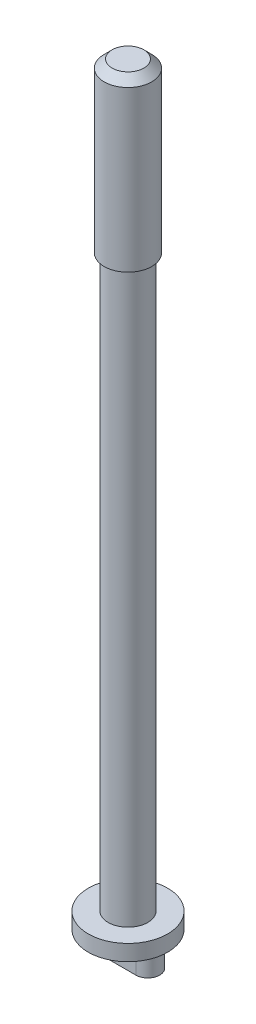
ISO-10303-21;
HEADER;
FILE_DESCRIPTION(('STEP AP214'),'2;1');
FILE_NAME('part.step','',(''),(''),'','','');
FILE_SCHEMA(('AUTOMOTIVE_DESIGN { 1 0 10303 214 1 1 1 1 }'));
ENDSEC;
DATA;
#1=APPLICATION_CONTEXT('core data for automotive mechanical design processes');
#2=APPLICATION_PROTOCOL_DEFINITION('international standard','automotive_design',2000,#1);
#3=PRODUCT_CONTEXT('',#1,'mechanical');
#4=PRODUCT('Part','Part','',(#3));
#5=PRODUCT_RELATED_PRODUCT_CATEGORY('part','',(#4));
#6=PRODUCT_DEFINITION_FORMATION('','',#4);
#7=PRODUCT_DEFINITION_CONTEXT('part definition',#1,'design');
#8=PRODUCT_DEFINITION('design','',#6,#7);
#9=PRODUCT_DEFINITION_SHAPE('','',#8);
#10=(LENGTH_UNIT() NAMED_UNIT(*) SI_UNIT(.MILLI.,.METRE.));
#11=(NAMED_UNIT(*) PLANE_ANGLE_UNIT() SI_UNIT($,.RADIAN.));
#12=(NAMED_UNIT(*) SI_UNIT($,.STERADIAN.) SOLID_ANGLE_UNIT());
#13=UNCERTAINTY_MEASURE_WITH_UNIT(LENGTH_MEASURE(1.E-05),#10,'distance_accuracy_value','');
#14=(GEOMETRIC_REPRESENTATION_CONTEXT(3) GLOBAL_UNCERTAINTY_ASSIGNED_CONTEXT((#13)) GLOBAL_UNIT_ASSIGNED_CONTEXT((#10,
#11,#12)) REPRESENTATION_CONTEXT('',''));
#15=CARTESIAN_POINT('',(0.,0.,0.));
#16=DIRECTION('',(0.,0.,1.));
#17=DIRECTION('',(1.,0.,0.));
#18=AXIS2_PLACEMENT_3D('',#15,#16,#17);
#19=CARTESIAN_POINT('',(-49.9082196139705,-89.7840104629929,0.000144362672608936));
#20=DIRECTION('',(0.,1.,0.));
#21=DIRECTION('',(0.,0.,1.));
#22=AXIS2_PLACEMENT_3D('',#19,#20,#21);
#23=PLANE('',#22);
#24=CARTESIAN_POINT('',(-47.4079596060045,-89.7840104629929,0.));
#25=DIRECTION('',(0.,-1.,0.));
#26=DIRECTION('',(0.,0.,-1.));
#27=AXIS2_PLACEMENT_3D('',#24,#25,#26);
#28=CIRCLE('',#27,1.5);
#29=CARTESIAN_POINT('',(-47.4080080433199,-89.7840104629929,1.49999999921794));
#30=VERTEX_POINT('',#29);
#31=CARTESIAN_POINT('',(-47.4079596060045,-89.7840104629929,-1.5));
#32=VERTEX_POINT('',#31);
#33=EDGE_CURVE('E60',#30,#32,#28,.F.);
#34=ORIENTED_EDGE('',*,*,#33,.F.);
#35=DIRECTION('',(0.999999999478628,0.,3.22915436094326E-05));
#36=VECTOR('',#35,1.);
#37=CARTESIAN_POINT('',(-52.3860001512234,-89.7840104629929,1.49983925216862));
#38=LINE('',#37,#36);
#39=CARTESIAN_POINT('',(-52.4300159249889,-89.7840104629929,1.49983783083134));
#40=VERTEX_POINT('',#39);
#41=EDGE_CURVE('E58',#40,#30,#38,.T.);
#42=ORIENTED_EDGE('',*,*,#41,.F.);
#43=CARTESIAN_POINT('',(-52.4079596060045,-89.7840104629929,0.));
#44=DIRECTION('',(0.,-1.,0.));
#45=DIRECTION('',(0.,0.,-1.));
#46=AXIS2_PLACEMENT_3D('',#43,#44,#45);
#47=CIRCLE('',#46,1.5);
#48=CARTESIAN_POINT('',(-52.4079596060045,-89.7840104629929,-1.5));
#49=VERTEX_POINT('',#48);
#50=EDGE_CURVE('E21',#49,#40,#47,.F.);
#51=ORIENTED_EDGE('',*,*,#50,.F.);
#52=DIRECTION('',(-1.,0.,0.));
#53=VECTOR('',#52,1.);
#54=CARTESIAN_POINT('',(-47.4079596060045,-89.7840104629929,-1.5));
#55=LINE('',#54,#53);
#56=EDGE_CURVE('E69',#32,#49,#55,.T.);
#57=ORIENTED_EDGE('',*,*,#56,.F.);
#58=EDGE_LOOP('',(#34,#42,#51,#57));
#59=FACE_BOUND('',#58,.T.);
#60=ADVANCED_FACE('F17',(#59),#23,.F.);
#61=CARTESIAN_POINT('',(-47.4079596060045,-86.7840104629929,-1.5));
#62=DIRECTION('',(0.,0.,-1.));
#63=DIRECTION('',(-1.,0.,0.));
#64=AXIS2_PLACEMENT_3D('',#61,#62,#63);
#65=PLANE('',#64);
#66=DIRECTION('',(1.,0.,0.));
#67=VECTOR('',#66,1.);
#68=CARTESIAN_POINT('',(-52.4233651177436,-86.7840104629929,-1.5));
#69=LINE('',#68,#67);
#70=CARTESIAN_POINT('',(-47.4079596060045,-86.7840104629929,-1.5));
#71=VERTEX_POINT('',#70);
#72=CARTESIAN_POINT('',(-52.4079596060045,-86.7840104629929,-1.5));
#73=VERTEX_POINT('',#72);
#74=EDGE_CURVE('E100',#71,#73,#69,.F.);
#75=ORIENTED_EDGE('',*,*,#74,.F.);
#76=DIRECTION('',(0.,-1.,0.));
#77=VECTOR('',#76,1.);
#78=CARTESIAN_POINT('',(-47.4079596060045,-86.7840104629929,-1.5));
#79=LINE('',#78,#77);
#80=EDGE_CURVE('E75',#32,#71,#79,.F.);
#81=ORIENTED_EDGE('',*,*,#80,.F.);
#82=ORIENTED_EDGE('',*,*,#56,.T.);
#83=DIRECTION('',(0.,-1.,0.));
#84=VECTOR('',#83,1.);
#85=CARTESIAN_POINT('',(-52.4079596060045,-86.7840104629929,-1.5));
#86=LINE('',#85,#84);
#87=EDGE_CURVE('E63',#73,#49,#86,.T.);
#88=ORIENTED_EDGE('',*,*,#87,.F.);
#89=EDGE_LOOP('',(#75,#81,#82,#88));
#90=FACE_BOUND('',#89,.T.);
#91=ADVANCED_FACE('F207',(#90),#65,.T.);
#92=CARTESIAN_POINT('',(-52.4079596060045,-86.7840104629929,0.));
#93=DIRECTION('',(0.,-1.,0.));
#94=DIRECTION('',(0.,0.,-1.));
#95=AXIS2_PLACEMENT_3D('',#92,#93,#94);
#96=CYLINDRICAL_SURFACE('',#95,1.5);
#97=CARTESIAN_POINT('',(-52.4079596060045,-86.7840104629929,0.));
#98=DIRECTION('',(0.,-1.,0.));
#99=DIRECTION('',(0.,0.,-1.));
#100=AXIS2_PLACEMENT_3D('',#97,#98,#99);
#101=CIRCLE('',#100,1.5);
#102=CARTESIAN_POINT('',(-52.4300159249889,-86.7840104629929,1.49983783083134));
#103=VERTEX_POINT('',#102);
#104=EDGE_CURVE('E99',#73,#103,#101,.F.);
#105=ORIENTED_EDGE('',*,*,#104,.F.);
#106=ORIENTED_EDGE('',*,*,#87,.T.);
#107=ORIENTED_EDGE('',*,*,#50,.T.);
#108=DIRECTION('',(0.,1.,0.));
#109=VECTOR('',#108,1.);
#110=CARTESIAN_POINT('',(-52.4300159249889,-86.7840104629929,1.49983783083134));
#111=LINE('',#110,#109);
#112=EDGE_CURVE('E62',#103,#40,#111,.F.);
#113=ORIENTED_EDGE('',*,*,#112,.F.);
#114=EDGE_LOOP('',(#105,#106,#107,#113));
#115=FACE_BOUND('',#114,.T.);
#116=ADVANCED_FACE('F68',(#115),#96,.T.);
#117=CARTESIAN_POINT('',(-52.3860001512234,-86.7840104629929,1.49983925216862));
#118=DIRECTION('',(-3.22915436094326E-05,0.,0.999999999478628));
#119=DIRECTION('',(0.999999999478628,0.,3.22915436094326E-05));
#120=AXIS2_PLACEMENT_3D('',#117,#118,#119);
#121=PLANE('',#120);
#122=DIRECTION('',(0.999999999478628,0.,3.22915436094275E-05));
#123=VECTOR('',#122,1.);
#124=CARTESIAN_POINT('',(-52.4300159249889,-86.7840104629929,1.49983783083134));
#125=LINE('',#124,#123);
#126=CARTESIAN_POINT('',(-47.4080080433199,-86.7840104629929,1.49999999921794));
#127=VERTEX_POINT('',#126);
#128=EDGE_CURVE('E72',#103,#127,#125,.T.);
#129=ORIENTED_EDGE('',*,*,#128,.F.);
#130=ORIENTED_EDGE('',*,*,#112,.T.);
#131=ORIENTED_EDGE('',*,*,#41,.T.);
#132=DIRECTION('',(0.,-1.,0.));
#133=VECTOR('',#132,1.);
#134=CARTESIAN_POINT('',(-47.4080080433199,-86.7840104629929,1.49999999921794));
#135=LINE('',#134,#133);
#136=EDGE_CURVE('E36',#127,#30,#135,.T.);
#137=ORIENTED_EDGE('',*,*,#136,.F.);
#138=EDGE_LOOP('',(#129,#130,#131,#137));
#139=FACE_BOUND('',#138,.T.);
#140=ADVANCED_FACE('F70',(#139),#121,.T.);
#141=CARTESIAN_POINT('',(-47.4079596060045,-86.7840104629929,0.));
#142=DIRECTION('',(0.,-1.,0.));
#143=DIRECTION('',(0.,0.,-1.));
#144=AXIS2_PLACEMENT_3D('',#141,#142,#143);
#145=CYLINDRICAL_SURFACE('',#144,1.5);
#146=CARTESIAN_POINT('',(-47.4079596060045,-86.7840104629929,0.));
#147=DIRECTION('',(0.,-1.,0.));
#148=DIRECTION('',(0.,0.,-1.));
#149=AXIS2_PLACEMENT_3D('',#146,#147,#148);
#150=CIRCLE('',#149,1.5);
#151=EDGE_CURVE('E96',#127,#71,#150,.F.);
#152=ORIENTED_EDGE('',*,*,#151,.F.);
#153=ORIENTED_EDGE('',*,*,#136,.T.);
#154=ORIENTED_EDGE('',*,*,#33,.T.);
#155=ORIENTED_EDGE('',*,*,#80,.T.);
#156=EDGE_LOOP('',(#152,#153,#154,#155));
#157=FACE_BOUND('',#156,.T.);
#158=ADVANCED_FACE('F110',(#157),#145,.T.);
#159=CARTESIAN_POINT('',(-50.3401825869688,8.21598953700711,0.));
#160=DIRECTION('',(0.,1.,0.));
#161=DIRECTION('',(0.,0.,1.));
#162=AXIS2_PLACEMENT_3D('',#159,#160,#161);
#163=PLANE('',#162);
#164=CARTESIAN_POINT('',(-49.9079596060045,8.21598953706078,0.));
#165=DIRECTION('',(0.,-1.,0.));
#166=DIRECTION('',(0.,0.,-1.));
#167=AXIS2_PLACEMENT_3D('',#164,#165,#166);
#168=CIRCLE('',#167,1.99999999995731);
#169=CARTESIAN_POINT('',(-49.9079596060045,8.21598953706078,-1.99999999995731));
#170=VERTEX_POINT('',#169);
#171=EDGE_CURVE('E93',#170,#170,#168,.T.);
#172=ORIENTED_EDGE('',*,*,#171,.F.);
#173=EDGE_LOOP('',(#172));
#174=FACE_BOUND('',#173,.T.);
#175=ADVANCED_FACE('F115',(#174),#163,.T.);
#176=CARTESIAN_POINT('',(-52.4233651177436,-86.7840104629929,0.));
#177=DIRECTION('',(0.,-1.,0.));
#178=DIRECTION('',(0.,0.,-1.));
#179=AXIS2_PLACEMENT_3D('',#176,#177,#178);
#180=PLANE('',#179);
#181=CARTESIAN_POINT('',(-49.9079596060045,-86.7840104629929,0.));
#182=DIRECTION('',(0.,1.,0.));
#183=DIRECTION('',(0.,0.,1.));
#184=AXIS2_PLACEMENT_3D('',#181,#182,#183);
#185=CIRCLE('',#184,4.99999999999998);
#186=CARTESIAN_POINT('',(-49.9079596060045,-86.7840104629929,4.99999999999998));
#187=VERTEX_POINT('',#186);
#188=EDGE_CURVE('E90',#187,#187,#185,.T.);
#189=ORIENTED_EDGE('',*,*,#188,.F.);
#190=EDGE_LOOP('',(#189));
#191=FACE_BOUND('',#190,.T.);
#192=ORIENTED_EDGE('',*,*,#128,.T.);
#193=ORIENTED_EDGE('',*,*,#151,.T.);
#194=ORIENTED_EDGE('',*,*,#74,.T.);
#195=ORIENTED_EDGE('',*,*,#104,.T.);
#196=EDGE_LOOP('',(#192,#193,#194,#195));
#197=FACE_BOUND('',#196,.T.);
#198=ADVANCED_FACE('F112',(#191,#197),#180,.T.);
#199=CARTESIAN_POINT('',(-49.9079596060045,7.2159895371442,0.));
#200=DIRECTION('',(0.,-1.,0.));
#201=DIRECTION('',(0.,0.,-1.));
#202=AXIS2_PLACEMENT_3D('',#199,#200,#201);
#203=CONICAL_SURFACE('',#202,2.99999999993073,0.78539816342587);
#204=CARTESIAN_POINT('',(-49.9079596060045,7.21598953700711,0.));
#205=DIRECTION('',(0.,1.,0.));
#206=DIRECTION('',(0.,0.,1.));
#207=AXIS2_PLACEMENT_3D('',#204,#205,#206);
#208=CIRCLE('',#207,3.00000000000002);
#209=CARTESIAN_POINT('',(-49.9079596060045,7.21598953700711,3.00000000000002));
#210=VERTEX_POINT('',#209);
#211=EDGE_CURVE('E89',#210,#210,#208,.F.);
#212=ORIENTED_EDGE('',*,*,#211,.F.);
#213=EDGE_LOOP('',(#212));
#214=FACE_BOUND('',#213,.T.);
#215=ORIENTED_EDGE('',*,*,#171,.T.);
#216=EDGE_LOOP('',(#215));
#217=FACE_BOUND('',#216,.T.);
#218=ADVANCED_FACE('F114',(#214,#217),#203,.T.);
#219=CARTESIAN_POINT('',(-49.9079596060045,-85.7840104629929,0.));
#220=DIRECTION('',(0.,1.,0.));
#221=DIRECTION('',(0.,0.,1.));
#222=AXIS2_PLACEMENT_3D('',#219,#220,#221);
#223=CYLINDRICAL_SURFACE('',#222,4.99999999999998);
#224=CARTESIAN_POINT('',(-49.9079596060045,-84.7840104629929,0.));
#225=DIRECTION('',(0.,1.,0.));
#226=DIRECTION('',(0.,0.,1.));
#227=AXIS2_PLACEMENT_3D('',#224,#225,#226);
#228=CIRCLE('',#227,4.99999999999998);
#229=CARTESIAN_POINT('',(-49.9079596060045,-84.7840104629929,4.99999999999998));
#230=VERTEX_POINT('',#229);
#231=EDGE_CURVE('E86',#230,#230,#228,.T.);
#232=ORIENTED_EDGE('',*,*,#231,.F.);
#233=EDGE_LOOP('',(#232));
#234=FACE_BOUND('',#233,.T.);
#235=ORIENTED_EDGE('',*,*,#188,.T.);
#236=EDGE_LOOP('',(#235));
#237=FACE_BOUND('',#236,.T.);
#238=ADVANCED_FACE('F123',(#234,#237),#223,.T.);
#239=CARTESIAN_POINT('',(-49.9079596060045,-2.36239348955209,0.));
#240=DIRECTION('',(0.,1.,0.));
#241=DIRECTION('',(0.,0.,1.));
#242=AXIS2_PLACEMENT_3D('',#239,#240,#241);
#243=CYLINDRICAL_SURFACE('',#242,3.00000000000002);
#244=ORIENTED_EDGE('',*,*,#211,.T.);
#245=EDGE_LOOP('',(#244));
#246=FACE_BOUND('',#245,.T.);
#247=CARTESIAN_POINT('',(-49.9079596060045,-12.9407765161113,0.));
#248=DIRECTION('',(0.,1.,0.));
#249=DIRECTION('',(0.,0.,1.));
#250=AXIS2_PLACEMENT_3D('',#247,#248,#249);
#251=CIRCLE('',#250,3.00000000000002);
#252=CARTESIAN_POINT('',(-49.9079596060045,-12.9407765161113,3.00000000000002));
#253=VERTEX_POINT('',#252);
#254=EDGE_CURVE('E83',#253,#253,#251,.F.);
#255=ORIENTED_EDGE('',*,*,#254,.F.);
#256=EDGE_LOOP('',(#255));
#257=FACE_BOUND('',#256,.T.);
#258=ADVANCED_FACE('F143',(#246,#257),#243,.T.);
#259=CARTESIAN_POINT('',(-53.6579596060045,-84.7840104629929,0.));
#260=DIRECTION('',(0.,1.,0.));
#261=DIRECTION('',(0.,0.,1.));
#262=AXIS2_PLACEMENT_3D('',#259,#260,#261);
#263=PLANE('',#262);
#264=ORIENTED_EDGE('',*,*,#231,.T.);
#265=EDGE_LOOP('',(#264));
#266=FACE_BOUND('',#265,.T.);
#267=CARTESIAN_POINT('',(-49.9079596060045,-84.7840104629929,0.));
#268=DIRECTION('',(0.,1.,0.));
#269=DIRECTION('',(0.,0.,1.));
#270=AXIS2_PLACEMENT_3D('',#267,#268,#269);
#271=CIRCLE('',#270,2.5);
#272=CARTESIAN_POINT('',(-49.9079596060045,-84.7840104629929,2.5));
#273=VERTEX_POINT('',#272);
#274=EDGE_CURVE('E27',#273,#273,#271,.T.);
#275=ORIENTED_EDGE('',*,*,#274,.F.);
#276=EDGE_LOOP('',(#275));
#277=FACE_BOUND('',#276,.T.);
#278=ADVANCED_FACE('F135',(#266,#277),#263,.T.);
#279=CARTESIAN_POINT('',(-52.6579596060045,-12.9407765161113,0.));
#280=DIRECTION('',(0.,-1.,0.));
#281=DIRECTION('',(0.,0.,-1.));
#282=AXIS2_PLACEMENT_3D('',#279,#280,#281);
#283=PLANE('',#282);
#284=CARTESIAN_POINT('',(-49.9079596060045,-12.9407765161113,0.));
#285=DIRECTION('',(0.,1.,0.));
#286=DIRECTION('',(0.,0.,1.));
#287=AXIS2_PLACEMENT_3D('',#284,#285,#286);
#288=CIRCLE('',#287,2.5);
#289=CARTESIAN_POINT('',(-49.9079596060045,-12.9407765161113,2.5));
#290=VERTEX_POINT('',#289);
#291=EDGE_CURVE('E11',#290,#290,#288,.F.);
#292=ORIENTED_EDGE('',*,*,#291,.F.);
#293=EDGE_LOOP('',(#292));
#294=FACE_BOUND('',#293,.T.);
#295=ORIENTED_EDGE('',*,*,#254,.T.);
#296=EDGE_LOOP('',(#295));
#297=FACE_BOUND('',#296,.T.);
#298=ADVANCED_FACE('F130',(#294,#297),#283,.T.);
#299=CARTESIAN_POINT('',(-49.9079596060045,-48.8623934895521,0.));
#300=DIRECTION('',(0.,1.,0.));
#301=DIRECTION('',(0.,0.,1.));
#302=AXIS2_PLACEMENT_3D('',#299,#300,#301);
#303=CYLINDRICAL_SURFACE('',#302,2.5);
#304=ORIENTED_EDGE('',*,*,#274,.T.);
#305=EDGE_LOOP('',(#304));
#306=FACE_BOUND('',#305,.T.);
#307=ORIENTED_EDGE('',*,*,#291,.T.);
#308=EDGE_LOOP('',(#307));
#309=FACE_BOUND('',#308,.T.);
#310=ADVANCED_FACE('F19',(#306,#309),#303,.T.);
#311=CLOSED_SHELL('',(#60,#91,#116,#140,#158,#175,#198,#218,#238,#258,#278,#298,#310));
#312=MANIFOLD_SOLID_BREP('B1',#311);
#313=ADVANCED_BREP_SHAPE_REPRESENTATION('',(#18,#312),#14);
#314=SHAPE_DEFINITION_REPRESENTATION(#9,#313);
ENDSEC;
END-ISO-10303-21;
